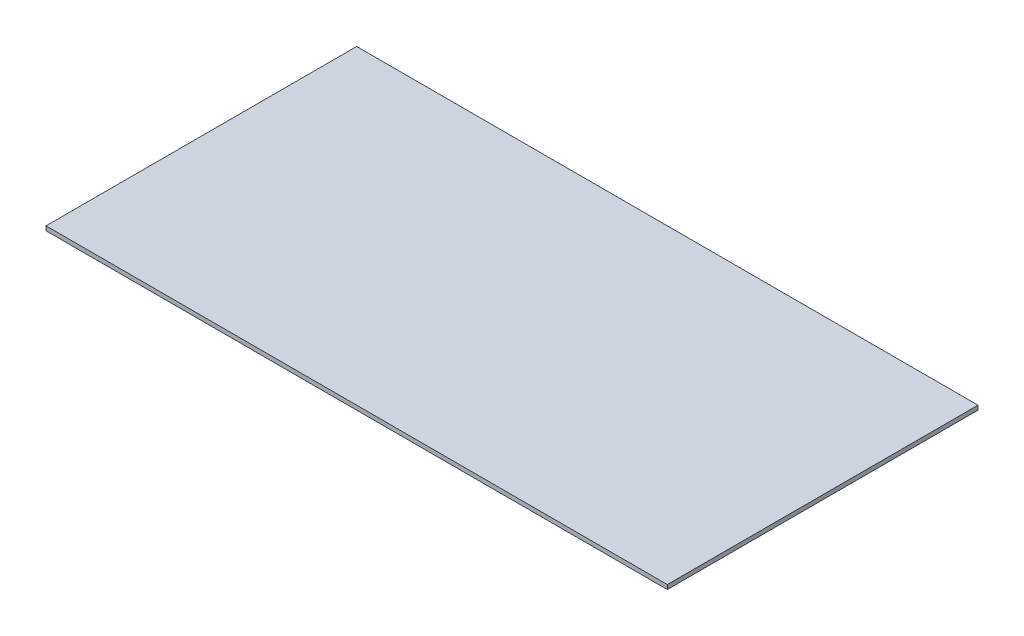
ISO-10303-21;
HEADER;
FILE_DESCRIPTION(('STEP AP214'),'2;1');
FILE_NAME('part.step','',(''),(''),'','','');
FILE_SCHEMA(('AUTOMOTIVE_DESIGN { 1 0 10303 214 1 1 1 1 }'));
ENDSEC;
DATA;
#1=APPLICATION_CONTEXT('core data for automotive mechanical design processes');
#2=APPLICATION_PROTOCOL_DEFINITION('international standard','automotive_design',2000,#1);
#3=PRODUCT_CONTEXT('',#1,'mechanical');
#4=PRODUCT('Part','Part','',(#3));
#5=PRODUCT_RELATED_PRODUCT_CATEGORY('part','',(#4));
#6=PRODUCT_DEFINITION_FORMATION('','',#4);
#7=PRODUCT_DEFINITION_CONTEXT('part definition',#1,'design');
#8=PRODUCT_DEFINITION('design','',#6,#7);
#9=PRODUCT_DEFINITION_SHAPE('','',#8);
#10=(LENGTH_UNIT() NAMED_UNIT(*) SI_UNIT(.MILLI.,.METRE.));
#11=(NAMED_UNIT(*) PLANE_ANGLE_UNIT() SI_UNIT($,.RADIAN.));
#12=(NAMED_UNIT(*) SI_UNIT($,.STERADIAN.) SOLID_ANGLE_UNIT());
#13=UNCERTAINTY_MEASURE_WITH_UNIT(LENGTH_MEASURE(1.E-05),#10,'distance_accuracy_value','');
#14=(GEOMETRIC_REPRESENTATION_CONTEXT(3) GLOBAL_UNCERTAINTY_ASSIGNED_CONTEXT((#13)) GLOBAL_UNIT_ASSIGNED_CONTEXT((#10,
#11,#12)) REPRESENTATION_CONTEXT('',''));
#15=CARTESIAN_POINT('',(0.,0.,0.));
#16=DIRECTION('',(0.,0.,1.));
#17=DIRECTION('',(1.,0.,0.));
#18=AXIS2_PLACEMENT_3D('',#15,#16,#17);
#19=CARTESIAN_POINT('',(-914.4,12.7,457.2));
#20=DIRECTION('',(1.,0.,0.));
#21=DIRECTION('',(0.,0.,-1.));
#22=AXIS2_PLACEMENT_3D('',#19,#20,#21);
#23=PLANE('',#22);
#24=DIRECTION('',(0.,0.,1.));
#25=VECTOR('',#24,1.);
#26=CARTESIAN_POINT('',(-914.4,0.,457.2));
#27=LINE('',#26,#25);
#28=CARTESIAN_POINT('',(-914.4,0.,-457.2));
#29=VERTEX_POINT('',#28);
#30=CARTESIAN_POINT('',(-914.4,0.,457.2));
#31=VERTEX_POINT('',#30);
#32=EDGE_CURVE('E99',#29,#31,#27,.T.);
#33=ORIENTED_EDGE('',*,*,#32,.T.);
#34=DIRECTION('',(0.,-1.,0.));
#35=VECTOR('',#34,1.);
#36=CARTESIAN_POINT('',(-914.4,12.7,457.2));
#37=LINE('',#36,#35);
#38=CARTESIAN_POINT('',(-914.4,12.7,457.2));
#39=VERTEX_POINT('',#38);
#40=EDGE_CURVE('E11',#39,#31,#37,.T.);
#41=ORIENTED_EDGE('',*,*,#40,.F.);
#42=DIRECTION('',(0.,0.,1.));
#43=VECTOR('',#42,1.);
#44=CARTESIAN_POINT('',(-914.4,12.7,457.2));
#45=LINE('',#44,#43);
#46=CARTESIAN_POINT('',(-914.4,12.7,-457.2));
#47=VERTEX_POINT('',#46);
#48=EDGE_CURVE('E87',#47,#39,#45,.T.);
#49=ORIENTED_EDGE('',*,*,#48,.F.);
#50=DIRECTION('',(0.,-1.,0.));
#51=VECTOR('',#50,1.);
#52=CARTESIAN_POINT('',(-914.4,12.7,-457.2));
#53=LINE('',#52,#51);
#54=EDGE_CURVE('E95',#47,#29,#53,.T.);
#55=ORIENTED_EDGE('',*,*,#54,.T.);
#56=EDGE_LOOP('',(#33,#41,#49,#55));
#57=FACE_BOUND('',#56,.T.);
#58=ADVANCED_FACE('F36',(#57),#23,.F.);
#59=CARTESIAN_POINT('',(914.4,12.7,457.2));
#60=DIRECTION('',(0.,0.,-1.));
#61=DIRECTION('',(-1.,0.,0.));
#62=AXIS2_PLACEMENT_3D('',#59,#60,#61);
#63=PLANE('',#62);
#64=DIRECTION('',(1.,0.,0.));
#65=VECTOR('',#64,1.);
#66=CARTESIAN_POINT('',(914.4,0.,457.2));
#67=LINE('',#66,#65);
#68=CARTESIAN_POINT('',(914.4,0.,457.2));
#69=VERTEX_POINT('',#68);
#70=EDGE_CURVE('E91',#31,#69,#67,.T.);
#71=ORIENTED_EDGE('',*,*,#70,.T.);
#72=DIRECTION('',(0.,-1.,0.));
#73=VECTOR('',#72,1.);
#74=CARTESIAN_POINT('',(914.4,12.7,457.2));
#75=LINE('',#74,#73);
#76=CARTESIAN_POINT('',(914.4,12.7,457.2));
#77=VERTEX_POINT('',#76);
#78=EDGE_CURVE('E44',#77,#69,#75,.T.);
#79=ORIENTED_EDGE('',*,*,#78,.F.);
#80=DIRECTION('',(1.,0.,0.));
#81=VECTOR('',#80,1.);
#82=CARTESIAN_POINT('',(914.4,12.7,457.2));
#83=LINE('',#82,#81);
#84=EDGE_CURVE('E82',#39,#77,#83,.T.);
#85=ORIENTED_EDGE('',*,*,#84,.F.);
#86=ORIENTED_EDGE('',*,*,#40,.T.);
#87=EDGE_LOOP('',(#71,#79,#85,#86));
#88=FACE_BOUND('',#87,.T.);
#89=ADVANCED_FACE('F90',(#88),#63,.F.);
#90=CARTESIAN_POINT('',(914.4,12.7,457.2));
#91=DIRECTION('',(-1.,0.,0.));
#92=DIRECTION('',(0.,0.,1.));
#93=AXIS2_PLACEMENT_3D('',#90,#91,#92);
#94=PLANE('',#93);
#95=DIRECTION('',(0.,0.,-1.));
#96=VECTOR('',#95,1.);
#97=CARTESIAN_POINT('',(914.4,0.,457.2));
#98=LINE('',#97,#96);
#99=CARTESIAN_POINT('',(914.4,0.,-457.2));
#100=VERTEX_POINT('',#99);
#101=EDGE_CURVE('E69',#69,#100,#98,.T.);
#102=ORIENTED_EDGE('',*,*,#101,.T.);
#103=DIRECTION('',(0.,-1.,0.));
#104=VECTOR('',#103,1.);
#105=CARTESIAN_POINT('',(914.4,12.7,-457.2));
#106=LINE('',#105,#104);
#107=CARTESIAN_POINT('',(914.4,12.7,-457.2));
#108=VERTEX_POINT('',#107);
#109=EDGE_CURVE('E92',#108,#100,#106,.T.);
#110=ORIENTED_EDGE('',*,*,#109,.F.);
#111=DIRECTION('',(0.,0.,-1.));
#112=VECTOR('',#111,1.);
#113=CARTESIAN_POINT('',(914.4,12.7,457.2));
#114=LINE('',#113,#112);
#115=EDGE_CURVE('E85',#77,#108,#114,.T.);
#116=ORIENTED_EDGE('',*,*,#115,.F.);
#117=ORIENTED_EDGE('',*,*,#78,.T.);
#118=EDGE_LOOP('',(#102,#110,#116,#117));
#119=FACE_BOUND('',#118,.T.);
#120=ADVANCED_FACE('F93',(#119),#94,.F.);
#121=CARTESIAN_POINT('',(914.4,12.7,-457.2));
#122=DIRECTION('',(0.,0.,1.));
#123=DIRECTION('',(1.,0.,0.));
#124=AXIS2_PLACEMENT_3D('',#121,#122,#123);
#125=PLANE('',#124);
#126=DIRECTION('',(-1.,0.,0.));
#127=VECTOR('',#126,1.);
#128=CARTESIAN_POINT('',(914.4,0.,-457.2));
#129=LINE('',#128,#127);
#130=EDGE_CURVE('E75',#100,#29,#129,.T.);
#131=ORIENTED_EDGE('',*,*,#130,.T.);
#132=ORIENTED_EDGE('',*,*,#54,.F.);
#133=DIRECTION('',(-1.,0.,0.));
#134=VECTOR('',#133,1.);
#135=CARTESIAN_POINT('',(914.4,12.7,-457.2));
#136=LINE('',#135,#134);
#137=EDGE_CURVE('E52',#108,#47,#136,.T.);
#138=ORIENTED_EDGE('',*,*,#137,.F.);
#139=ORIENTED_EDGE('',*,*,#109,.T.);
#140=EDGE_LOOP('',(#131,#132,#138,#139));
#141=FACE_BOUND('',#140,.T.);
#142=ADVANCED_FACE('F106',(#141),#125,.F.);
#143=CARTESIAN_POINT('',(0.,12.7,0.));
#144=DIRECTION('',(0.,1.,0.));
#145=DIRECTION('',(0.,0.,1.));
#146=AXIS2_PLACEMENT_3D('',#143,#144,#145);
#147=PLANE('',#146);
#148=ORIENTED_EDGE('',*,*,#48,.T.);
#149=ORIENTED_EDGE('',*,*,#84,.T.);
#150=ORIENTED_EDGE('',*,*,#115,.T.);
#151=ORIENTED_EDGE('',*,*,#137,.T.);
#152=EDGE_LOOP('',(#148,#149,#150,#151));
#153=FACE_BOUND('',#152,.T.);
#154=ADVANCED_FACE('F83',(#153),#147,.T.);
#155=CARTESIAN_POINT('',(0.,0.,0.));
#156=DIRECTION('',(0.,1.,0.));
#157=DIRECTION('',(0.,0.,1.));
#158=AXIS2_PLACEMENT_3D('',#155,#156,#157);
#159=PLANE('',#158);
#160=ORIENTED_EDGE('',*,*,#32,.F.);
#161=ORIENTED_EDGE('',*,*,#130,.F.);
#162=ORIENTED_EDGE('',*,*,#101,.F.);
#163=ORIENTED_EDGE('',*,*,#70,.F.);
#164=EDGE_LOOP('',(#160,#161,#162,#163));
#165=FACE_BOUND('',#164,.T.);
#166=ADVANCED_FACE('F109',(#165),#159,.F.);
#167=CLOSED_SHELL('',(#58,#89,#120,#142,#154,#166));
#168=MANIFOLD_SOLID_BREP('B2',#167);
#169=ADVANCED_BREP_SHAPE_REPRESENTATION('',(#18,#168),#14);
#170=SHAPE_DEFINITION_REPRESENTATION(#9,#169);
ENDSEC;
END-ISO-10303-21;
